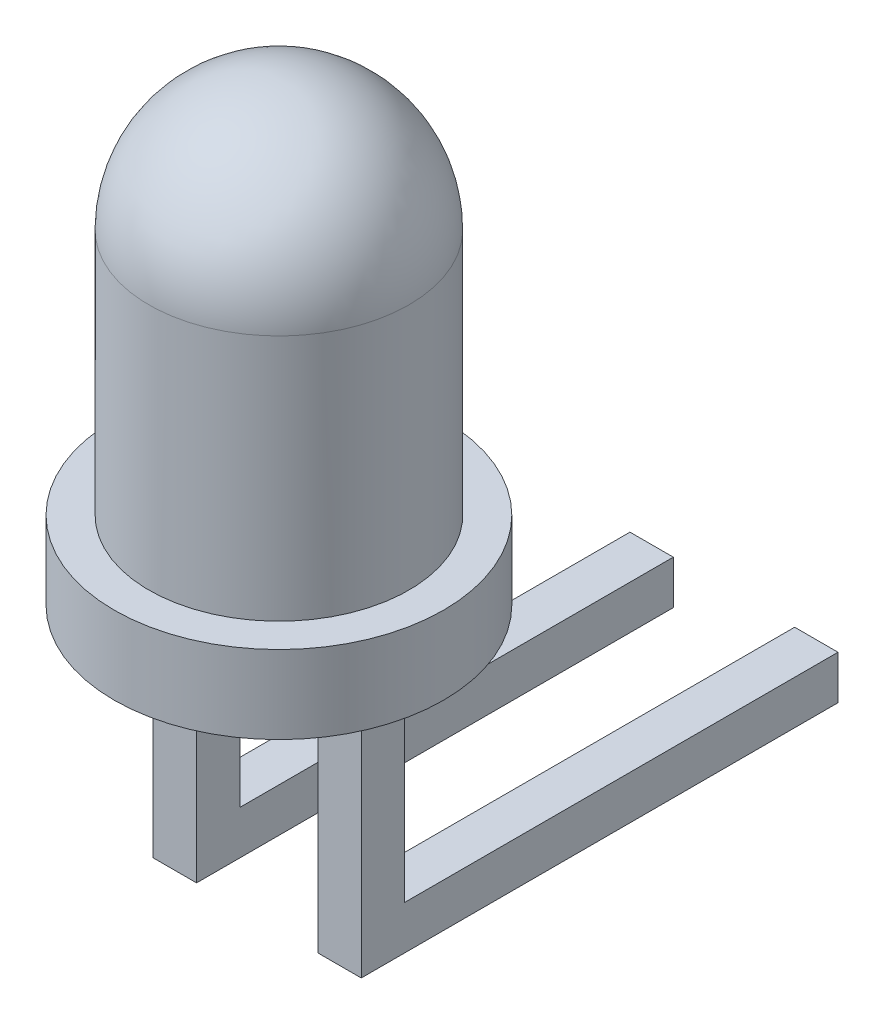
ISO-10303-21;
HEADER;
FILE_DESCRIPTION(('STEP AP214'),'2;1');
FILE_NAME('part.step','',(''),(''),'','','');
FILE_SCHEMA(('AUTOMOTIVE_DESIGN { 1 0 10303 214 1 1 1 1 }'));
ENDSEC;
DATA;
#1=APPLICATION_CONTEXT('core data for automotive mechanical design processes');
#2=APPLICATION_PROTOCOL_DEFINITION('international standard','automotive_design',2000,#1);
#3=PRODUCT_CONTEXT('',#1,'mechanical');
#4=PRODUCT('Part','Part','',(#3));
#5=PRODUCT_RELATED_PRODUCT_CATEGORY('part','',(#4));
#6=PRODUCT_DEFINITION_FORMATION('','',#4);
#7=PRODUCT_DEFINITION_CONTEXT('part definition',#1,'design');
#8=PRODUCT_DEFINITION('design','',#6,#7);
#9=PRODUCT_DEFINITION_SHAPE('','',#8);
#10=(LENGTH_UNIT() NAMED_UNIT(*) SI_UNIT(.MILLI.,.METRE.));
#11=(NAMED_UNIT(*) PLANE_ANGLE_UNIT() SI_UNIT($,.RADIAN.));
#12=(NAMED_UNIT(*) SI_UNIT($,.STERADIAN.) SOLID_ANGLE_UNIT());
#13=UNCERTAINTY_MEASURE_WITH_UNIT(LENGTH_MEASURE(1.E-05),#10,'distance_accuracy_value','');
#14=(GEOMETRIC_REPRESENTATION_CONTEXT(3) GLOBAL_UNCERTAINTY_ASSIGNED_CONTEXT((#13)) GLOBAL_UNIT_ASSIGNED_CONTEXT((#10,
#11,#12)) REPRESENTATION_CONTEXT('',''));
#15=CARTESIAN_POINT('',(0.,0.,0.));
#16=DIRECTION('',(0.,0.,1.));
#17=DIRECTION('',(1.,0.,0.));
#18=AXIS2_PLACEMENT_3D('',#15,#16,#17);
#19=CARTESIAN_POINT('',(0.,0.,-0.25));
#20=DIRECTION('',(0.,0.,-1.));
#21=DIRECTION('',(-1.,0.,0.));
#22=AXIS2_PLACEMENT_3D('',#19,#20,#21);
#23=PLANE('',#22);
#24=DIRECTION('',(0.,1.,0.));
#25=VECTOR('',#24,1.);
#26=CARTESIAN_POINT('',(1.2,2.31652278103782,-0.25));
#27=LINE('',#26,#25);
#28=CARTESIAN_POINT('',(1.2,-0.178679438290557,-0.25));
#29=VERTEX_POINT('',#28);
#30=CARTESIAN_POINT('',(1.2,2.31652278103782,-0.25));
#31=VERTEX_POINT('',#30);
#32=EDGE_CURVE('E168',#29,#31,#27,.T.);
#33=ORIENTED_EDGE('',*,*,#32,.F.);
#34=DIRECTION('',(1.,0.,0.));
#35=VECTOR('',#34,1.);
#36=CARTESIAN_POINT('',(0.700000000000002,-0.178679438290557,-0.25));
#37=LINE('',#36,#35);
#38=CARTESIAN_POINT('',(0.700000000000002,-0.178679438290557,-0.25));
#39=VERTEX_POINT('',#38);
#40=EDGE_CURVE('E140',#39,#29,#37,.T.);
#41=ORIENTED_EDGE('',*,*,#40,.F.);
#42=DIRECTION('',(0.,-1.,0.));
#43=VECTOR('',#42,1.);
#44=CARTESIAN_POINT('',(0.700000000000002,-0.683477218962181,-0.25));
#45=LINE('',#44,#43);
#46=CARTESIAN_POINT('',(0.700000000000001,2.31652278103782,-0.25));
#47=VERTEX_POINT('',#46);
#48=EDGE_CURVE('E145',#47,#39,#45,.T.);
#49=ORIENTED_EDGE('',*,*,#48,.F.);
#50=DIRECTION('',(-1.,0.,0.));
#51=VECTOR('',#50,1.);
#52=CARTESIAN_POINT('',(0.700000000000001,2.31652278103782,-0.25));
#53=LINE('',#52,#51);
#54=EDGE_CURVE('E178',#31,#47,#53,.T.);
#55=ORIENTED_EDGE('',*,*,#54,.F.);
#56=EDGE_LOOP('',(#33,#41,#49,#55));
#57=FACE_BOUND('',#56,.T.);
#58=ADVANCED_FACE('F32',(#57),#23,.T.);
#59=CARTESIAN_POINT('',(0.,0.,-0.25));
#60=DIRECTION('',(0.,0.,-1.));
#61=DIRECTION('',(-1.,0.,0.));
#62=AXIS2_PLACEMENT_3D('',#59,#60,#61);
#63=PLANE('',#62);
#64=DIRECTION('',(0.,1.,0.));
#65=VECTOR('',#64,1.);
#66=CARTESIAN_POINT('',(-0.699999999999999,2.31652278103782,-0.25));
#67=LINE('',#66,#65);
#68=CARTESIAN_POINT('',(-0.699999999999999,-0.178679438290556,-0.25));
#69=VERTEX_POINT('',#68);
#70=CARTESIAN_POINT('',(-0.699999999999999,2.31652278103782,-0.25));
#71=VERTEX_POINT('',#70);
#72=EDGE_CURVE('E192',#69,#71,#67,.T.);
#73=ORIENTED_EDGE('',*,*,#72,.F.);
#74=DIRECTION('',(1.,0.,0.));
#75=VECTOR('',#74,1.);
#76=CARTESIAN_POINT('',(-1.2,-0.178679438290556,-0.25));
#77=LINE('',#76,#75);
#78=CARTESIAN_POINT('',(-1.2,-0.178679438290556,-0.25));
#79=VERTEX_POINT('',#78);
#80=EDGE_CURVE('E146',#79,#69,#77,.T.);
#81=ORIENTED_EDGE('',*,*,#80,.F.);
#82=DIRECTION('',(0.,-1.,0.));
#83=VECTOR('',#82,1.);
#84=CARTESIAN_POINT('',(-1.2,-0.68347721896218,-0.25));
#85=LINE('',#84,#83);
#86=CARTESIAN_POINT('',(-1.2,2.31652278103782,-0.25));
#87=VERTEX_POINT('',#86);
#88=EDGE_CURVE('E201',#87,#79,#85,.T.);
#89=ORIENTED_EDGE('',*,*,#88,.F.);
#90=DIRECTION('',(-1.,0.,0.));
#91=VECTOR('',#90,1.);
#92=CARTESIAN_POINT('',(-0.699999999999999,2.31652278103782,-0.25));
#93=LINE('',#92,#91);
#94=EDGE_CURVE('E187',#71,#87,#93,.T.);
#95=ORIENTED_EDGE('',*,*,#94,.F.);
#96=EDGE_LOOP('',(#73,#81,#89,#95));
#97=FACE_BOUND('',#96,.T.);
#98=ADVANCED_FACE('F228',(#97),#63,.T.);
#99=CARTESIAN_POINT('',(-1.9,2.31652278103782,0.));
#100=DIRECTION('',(0.,-1.,0.));
#101=DIRECTION('',(1.,0.,0.));
#102=AXIS2_PLACEMENT_3D('',#99,#100,#101);
#103=PLANE('',#102);
#104=CARTESIAN_POINT('',(0.,2.31652278103782,0.));
#105=DIRECTION('',(0.,1.,0.));
#106=DIRECTION('',(-1.,0.,0.));
#107=AXIS2_PLACEMENT_3D('',#104,#105,#106);
#108=CIRCLE('',#107,1.9);
#109=CARTESIAN_POINT('',(-1.9,2.31652278103782,0.));
#110=VERTEX_POINT('',#109);
#111=EDGE_CURVE('E40',#110,#110,#108,.T.);
#112=ORIENTED_EDGE('',*,*,#111,.F.);
#113=EDGE_LOOP('',(#112));
#114=FACE_BOUND('',#113,.T.);
#115=DIRECTION('',(0.,0.,-1.));
#116=VECTOR('',#115,1.);
#117=CARTESIAN_POINT('',(-1.2,2.31652278103782,0.25));
#118=LINE('',#117,#116);
#119=CARTESIAN_POINT('',(-1.2,2.31652278103782,0.25));
#120=VERTEX_POINT('',#119);
#121=EDGE_CURVE('E211',#120,#87,#118,.T.);
#122=ORIENTED_EDGE('',*,*,#121,.F.);
#123=DIRECTION('',(-1.,0.,0.));
#124=VECTOR('',#123,1.);
#125=CARTESIAN_POINT('',(-0.699999999999999,2.31652278103782,0.25));
#126=LINE('',#125,#124);
#127=CARTESIAN_POINT('',(-0.699999999999999,2.31652278103782,0.25));
#128=VERTEX_POINT('',#127);
#129=EDGE_CURVE('E188',#128,#120,#126,.T.);
#130=ORIENTED_EDGE('',*,*,#129,.F.);
#131=DIRECTION('',(0.,0.,-1.));
#132=VECTOR('',#131,1.);
#133=CARTESIAN_POINT('',(-0.699999999999999,2.31652278103782,0.25));
#134=LINE('',#133,#132);
#135=EDGE_CURVE('E199',#128,#71,#134,.T.);
#136=ORIENTED_EDGE('',*,*,#135,.T.);
#137=ORIENTED_EDGE('',*,*,#94,.T.);
#138=EDGE_LOOP('',(#122,#130,#136,#137));
#139=FACE_BOUND('',#138,.T.);
#140=DIRECTION('',(0.,0.,-1.));
#141=VECTOR('',#140,1.);
#142=CARTESIAN_POINT('',(0.700000000000001,2.31652278103782,0.25));
#143=LINE('',#142,#141);
#144=CARTESIAN_POINT('',(0.700000000000001,2.31652278103782,0.25));
#145=VERTEX_POINT('',#144);
#146=EDGE_CURVE('E52',#145,#47,#143,.T.);
#147=ORIENTED_EDGE('',*,*,#146,.F.);
#148=DIRECTION('',(-1.,0.,0.));
#149=VECTOR('',#148,1.);
#150=CARTESIAN_POINT('',(0.700000000000001,2.31652278103782,0.25));
#151=LINE('',#150,#149);
#152=CARTESIAN_POINT('',(1.2,2.31652278103782,0.25));
#153=VERTEX_POINT('',#152);
#154=EDGE_CURVE('E47',#153,#145,#151,.T.);
#155=ORIENTED_EDGE('',*,*,#154,.F.);
#156=DIRECTION('',(0.,0.,-1.));
#157=VECTOR('',#156,1.);
#158=CARTESIAN_POINT('',(1.2,2.31652278103782,0.25));
#159=LINE('',#158,#157);
#160=EDGE_CURVE('E185',#153,#31,#159,.T.);
#161=ORIENTED_EDGE('',*,*,#160,.T.);
#162=ORIENTED_EDGE('',*,*,#54,.T.);
#163=EDGE_LOOP('',(#147,#155,#161,#162));
#164=FACE_BOUND('',#163,.T.);
#165=ADVANCED_FACE('F225',(#114,#139,#164),#103,.T.);
#166=CARTESIAN_POINT('',(-1.5,3.21652278103782,0.));
#167=DIRECTION('',(0.,1.,0.));
#168=DIRECTION('',(-1.,0.,0.));
#169=AXIS2_PLACEMENT_3D('',#166,#167,#168);
#170=PLANE('',#169);
#171=CARTESIAN_POINT('',(0.,3.21652278103782,0.));
#172=DIRECTION('',(0.,1.,0.));
#173=DIRECTION('',(-1.,0.,0.));
#174=AXIS2_PLACEMENT_3D('',#171,#172,#173);
#175=CIRCLE('',#174,1.9);
#176=CARTESIAN_POINT('',(-1.9,3.21652278103782,0.));
#177=VERTEX_POINT('',#176);
#178=EDGE_CURVE('E11',#177,#177,#175,.T.);
#179=ORIENTED_EDGE('',*,*,#178,.T.);
#180=EDGE_LOOP('',(#179));
#181=FACE_BOUND('',#180,.T.);
#182=CARTESIAN_POINT('',(0.,3.21652278103782,0.));
#183=DIRECTION('',(0.,1.,0.));
#184=DIRECTION('',(-1.,0.,0.));
#185=AXIS2_PLACEMENT_3D('',#182,#183,#184);
#186=CIRCLE('',#185,1.5);
#187=CARTESIAN_POINT('',(-1.5,3.21652278103782,0.));
#188=VERTEX_POINT('',#187);
#189=EDGE_CURVE('E214',#188,#188,#186,.T.);
#190=ORIENTED_EDGE('',*,*,#189,.F.);
#191=EDGE_LOOP('',(#190));
#192=FACE_BOUND('',#191,.T.);
#193=ADVANCED_FACE('F34',(#181,#192),#170,.T.);
#194=CARTESIAN_POINT('',(0.,7.56652278103782,0.));
#195=DIRECTION('',(0.,1.,0.));
#196=DIRECTION('',(-1.,0.,0.));
#197=AXIS2_PLACEMENT_3D('',#194,#195,#196);
#198=CYLINDRICAL_SURFACE('',#197,1.9);
#199=ORIENTED_EDGE('',*,*,#111,.T.);
#200=EDGE_LOOP('',(#199));
#201=FACE_BOUND('',#200,.T.);
#202=ORIENTED_EDGE('',*,*,#178,.F.);
#203=EDGE_LOOP('',(#202));
#204=FACE_BOUND('',#203,.T.);
#205=ADVANCED_FACE('F222',(#201,#204),#198,.T.);
#206=CARTESIAN_POINT('',(0.,6.06652278103782,0.));
#207=DIRECTION('',(0.,1.,0.));
#208=DIRECTION('',(1.,0.,0.));
#209=AXIS2_PLACEMENT_3D('',#206,#207,#208);
#210=SPHERICAL_SURFACE('',#209,1.5);
#211=CARTESIAN_POINT('',(0.,6.06652278103782,0.));
#212=DIRECTION('',(0.,1.,0.));
#213=DIRECTION('',(-1.,0.,0.));
#214=AXIS2_PLACEMENT_3D('',#211,#212,#213);
#215=CIRCLE('',#214,1.5);
#216=CARTESIAN_POINT('',(-1.5,6.06652278103782,0.));
#217=VERTEX_POINT('',#216);
#218=EDGE_CURVE('E217',#217,#217,#215,.T.);
#219=ORIENTED_EDGE('',*,*,#218,.T.);
#220=EDGE_LOOP('',(#219));
#221=FACE_BOUND('',#220,.T.);
#222=ADVANCED_FACE('F409',(#221),#210,.T.);
#223=CARTESIAN_POINT('',(0.,7.56652278103782,0.));
#224=DIRECTION('',(0.,1.,0.));
#225=DIRECTION('',(-1.,0.,0.));
#226=AXIS2_PLACEMENT_3D('',#223,#224,#225);
#227=CYLINDRICAL_SURFACE('',#226,1.5);
#228=ORIENTED_EDGE('',*,*,#189,.T.);
#229=EDGE_LOOP('',(#228));
#230=FACE_BOUND('',#229,.T.);
#231=ORIENTED_EDGE('',*,*,#218,.F.);
#232=EDGE_LOOP('',(#231));
#233=FACE_BOUND('',#232,.T.);
#234=ADVANCED_FACE('F265',(#230,#233),#227,.T.);
#235=CARTESIAN_POINT('',(-1.2,-0.68347721896218,0.25));
#236=DIRECTION('',(1.,0.,0.));
#237=DIRECTION('',(0.,0.,-1.));
#238=AXIS2_PLACEMENT_3D('',#235,#236,#237);
#239=PLANE('',#238);
#240=ORIENTED_EDGE('',*,*,#88,.T.);
#241=DIRECTION('',(0.,0.,1.));
#242=VECTOR('',#241,1.);
#243=CARTESIAN_POINT('',(-1.2,-0.178679438290556,-5.25));
#244=LINE('',#243,#242);
#245=CARTESIAN_POINT('',(-1.2,-0.178679438290556,-5.25));
#246=VERTEX_POINT('',#245);
#247=EDGE_CURVE('E166',#246,#79,#244,.T.);
#248=ORIENTED_EDGE('',*,*,#247,.F.);
#249=DIRECTION('',(0.,1.,0.));
#250=VECTOR('',#249,1.);
#251=CARTESIAN_POINT('',(-1.2,-0.68347721896218,-5.25));
#252=LINE('',#251,#250);
#253=CARTESIAN_POINT('',(-1.2,-0.68347721896218,-5.25));
#254=VERTEX_POINT('',#253);
#255=EDGE_CURVE('E148',#254,#246,#252,.T.);
#256=ORIENTED_EDGE('',*,*,#255,.F.);
#257=DIRECTION('',(0.,0.,-1.));
#258=VECTOR('',#257,1.);
#259=CARTESIAN_POINT('',(-1.2,-0.68347721896218,0.25));
#260=LINE('',#259,#258);
#261=CARTESIAN_POINT('',(-1.2,-0.68347721896218,0.25));
#262=VERTEX_POINT('',#261);
#263=EDGE_CURVE('E209',#262,#254,#260,.T.);
#264=ORIENTED_EDGE('',*,*,#263,.F.);
#265=DIRECTION('',(0.,-1.,0.));
#266=VECTOR('',#265,1.);
#267=CARTESIAN_POINT('',(-1.2,-0.68347721896218,0.25));
#268=LINE('',#267,#266);
#269=EDGE_CURVE('E191',#120,#262,#268,.T.);
#270=ORIENTED_EDGE('',*,*,#269,.F.);
#271=ORIENTED_EDGE('',*,*,#121,.T.);
#272=EDGE_LOOP('',(#240,#248,#256,#264,#270,#271));
#273=FACE_BOUND('',#272,.T.);
#274=ADVANCED_FACE('F235',(#273),#239,.F.);
#275=CARTESIAN_POINT('',(-0.699999999999999,-0.68347721896218,0.25));
#276=DIRECTION('',(0.,1.,0.));
#277=DIRECTION('',(0.,0.,1.));
#278=AXIS2_PLACEMENT_3D('',#275,#276,#277);
#279=PLANE('',#278);
#280=ORIENTED_EDGE('',*,*,#263,.T.);
#281=DIRECTION('',(-1.,0.,0.));
#282=VECTOR('',#281,1.);
#283=CARTESIAN_POINT('',(-1.2,-0.68347721896218,-5.25));
#284=LINE('',#283,#282);
#285=CARTESIAN_POINT('',(-0.699999999999999,-0.68347721896218,-5.25));
#286=VERTEX_POINT('',#285);
#287=EDGE_CURVE('E160',#286,#254,#284,.T.);
#288=ORIENTED_EDGE('',*,*,#287,.F.);
#289=DIRECTION('',(0.,0.,-1.));
#290=VECTOR('',#289,1.);
#291=CARTESIAN_POINT('',(-0.699999999999999,-0.68347721896218,0.25));
#292=LINE('',#291,#290);
#293=CARTESIAN_POINT('',(-0.699999999999999,-0.68347721896218,0.25));
#294=VERTEX_POINT('',#293);
#295=EDGE_CURVE('E207',#294,#286,#292,.T.);
#296=ORIENTED_EDGE('',*,*,#295,.F.);
#297=DIRECTION('',(1.,0.,0.));
#298=VECTOR('',#297,1.);
#299=CARTESIAN_POINT('',(-0.699999999999999,-0.68347721896218,0.25));
#300=LINE('',#299,#298);
#301=EDGE_CURVE('E194',#262,#294,#300,.T.);
#302=ORIENTED_EDGE('',*,*,#301,.F.);
#303=EDGE_LOOP('',(#280,#288,#296,#302));
#304=FACE_BOUND('',#303,.T.);
#305=ADVANCED_FACE('F257',(#304),#279,.F.);
#306=CARTESIAN_POINT('',(-0.699999999999999,2.31652278103782,0.25));
#307=DIRECTION('',(-1.,0.,0.));
#308=DIRECTION('',(0.,-1.,0.));
#309=AXIS2_PLACEMENT_3D('',#306,#307,#308);
#310=PLANE('',#309);
#311=ORIENTED_EDGE('',*,*,#295,.T.);
#312=DIRECTION('',(0.,-1.,0.));
#313=VECTOR('',#312,1.);
#314=CARTESIAN_POINT('',(-0.699999999999999,-0.68347721896218,-5.25));
#315=LINE('',#314,#313);
#316=CARTESIAN_POINT('',(-0.699999999999999,-0.178679438290556,-5.25));
#317=VERTEX_POINT('',#316);
#318=EDGE_CURVE('E157',#317,#286,#315,.T.);
#319=ORIENTED_EDGE('',*,*,#318,.F.);
#320=DIRECTION('',(0.,0.,1.));
#321=VECTOR('',#320,1.);
#322=CARTESIAN_POINT('',(-0.699999999999999,-0.178679438290556,-5.25));
#323=LINE('',#322,#321);
#324=EDGE_CURVE('E162',#317,#69,#323,.T.);
#325=ORIENTED_EDGE('',*,*,#324,.T.);
#326=ORIENTED_EDGE('',*,*,#72,.T.);
#327=ORIENTED_EDGE('',*,*,#135,.F.);
#328=DIRECTION('',(0.,1.,0.));
#329=VECTOR('',#328,1.);
#330=CARTESIAN_POINT('',(-0.699999999999999,2.31652278103782,0.25));
#331=LINE('',#330,#329);
#332=EDGE_CURVE('E196',#294,#128,#331,.T.);
#333=ORIENTED_EDGE('',*,*,#332,.F.);
#334=EDGE_LOOP('',(#311,#319,#325,#326,#327,#333));
#335=FACE_BOUND('',#334,.T.);
#336=ADVANCED_FACE('F244',(#335),#310,.F.);
#337=CARTESIAN_POINT('',(0.,0.,0.25));
#338=DIRECTION('',(0.,0.,-1.));
#339=DIRECTION('',(-1.,0.,0.));
#340=AXIS2_PLACEMENT_3D('',#337,#338,#339);
#341=PLANE('',#340);
#342=ORIENTED_EDGE('',*,*,#129,.T.);
#343=ORIENTED_EDGE('',*,*,#269,.T.);
#344=ORIENTED_EDGE('',*,*,#301,.T.);
#345=ORIENTED_EDGE('',*,*,#332,.T.);
#346=EDGE_LOOP('',(#342,#343,#344,#345));
#347=FACE_BOUND('',#346,.T.);
#348=ADVANCED_FACE('F239',(#347),#341,.F.);
#349=CARTESIAN_POINT('',(1.2,2.31652278103782,0.25));
#350=DIRECTION('',(-1.,0.,0.));
#351=DIRECTION('',(0.,-1.,0.));
#352=AXIS2_PLACEMENT_3D('',#349,#350,#351);
#353=PLANE('',#352);
#354=DIRECTION('',(0.,0.,-1.));
#355=VECTOR('',#354,1.);
#356=CARTESIAN_POINT('',(1.2,-0.68347721896218,0.25));
#357=LINE('',#356,#355);
#358=CARTESIAN_POINT('',(1.2,-0.68347721896218,0.25));
#359=VERTEX_POINT('',#358);
#360=CARTESIAN_POINT('',(1.2,-0.683477218962181,-5.25));
#361=VERTEX_POINT('',#360);
#362=EDGE_CURVE('E176',#359,#361,#357,.T.);
#363=ORIENTED_EDGE('',*,*,#362,.T.);
#364=DIRECTION('',(0.,-1.,0.));
#365=VECTOR('',#364,1.);
#366=CARTESIAN_POINT('',(1.2,-0.683477218962181,-5.25));
#367=LINE('',#366,#365);
#368=CARTESIAN_POINT('',(1.2,-0.178679438290557,-5.25));
#369=VERTEX_POINT('',#368);
#370=EDGE_CURVE('E130',#369,#361,#367,.T.);
#371=ORIENTED_EDGE('',*,*,#370,.F.);
#372=DIRECTION('',(0.,0.,1.));
#373=VECTOR('',#372,1.);
#374=CARTESIAN_POINT('',(1.2,-0.178679438290557,-5.25));
#375=LINE('',#374,#373);
#376=EDGE_CURVE('E126',#369,#29,#375,.T.);
#377=ORIENTED_EDGE('',*,*,#376,.T.);
#378=ORIENTED_EDGE('',*,*,#32,.T.);
#379=ORIENTED_EDGE('',*,*,#160,.F.);
#380=DIRECTION('',(0.,1.,0.));
#381=VECTOR('',#380,1.);
#382=CARTESIAN_POINT('',(1.2,2.31652278103782,0.25));
#383=LINE('',#382,#381);
#384=EDGE_CURVE('E169',#359,#153,#383,.T.);
#385=ORIENTED_EDGE('',*,*,#384,.F.);
#386=EDGE_LOOP('',(#363,#371,#377,#378,#379,#385));
#387=FACE_BOUND('',#386,.T.);
#388=ADVANCED_FACE('F285',(#387),#353,.F.);
#389=CARTESIAN_POINT('',(0.700000000000002,-0.683477218962181,0.25));
#390=DIRECTION('',(1.,0.,0.));
#391=DIRECTION('',(0.,1.,0.));
#392=AXIS2_PLACEMENT_3D('',#389,#390,#391);
#393=PLANE('',#392);
#394=ORIENTED_EDGE('',*,*,#48,.T.);
#395=DIRECTION('',(0.,0.,1.));
#396=VECTOR('',#395,1.);
#397=CARTESIAN_POINT('',(0.700000000000002,-0.178679438290557,-5.25));
#398=LINE('',#397,#396);
#399=CARTESIAN_POINT('',(0.700000000000002,-0.178679438290557,-5.25));
#400=VERTEX_POINT('',#399);
#401=EDGE_CURVE('E123',#400,#39,#398,.T.);
#402=ORIENTED_EDGE('',*,*,#401,.F.);
#403=DIRECTION('',(0.,1.,0.));
#404=VECTOR('',#403,1.);
#405=CARTESIAN_POINT('',(0.700000000000002,-0.683477218962181,-5.25));
#406=LINE('',#405,#404);
#407=CARTESIAN_POINT('',(0.700000000000002,-0.683477218962181,-5.25));
#408=VERTEX_POINT('',#407);
#409=EDGE_CURVE('E131',#408,#400,#406,.T.);
#410=ORIENTED_EDGE('',*,*,#409,.F.);
#411=DIRECTION('',(0.,0.,-1.));
#412=VECTOR('',#411,1.);
#413=CARTESIAN_POINT('',(0.700000000000002,-0.683477218962181,0.25));
#414=LINE('',#413,#412);
#415=CARTESIAN_POINT('',(0.700000000000002,-0.683477218962181,0.25));
#416=VERTEX_POINT('',#415);
#417=EDGE_CURVE('E182',#416,#408,#414,.T.);
#418=ORIENTED_EDGE('',*,*,#417,.F.);
#419=DIRECTION('',(0.,-1.,0.));
#420=VECTOR('',#419,1.);
#421=CARTESIAN_POINT('',(0.700000000000002,-0.683477218962181,0.25));
#422=LINE('',#421,#420);
#423=EDGE_CURVE('E172',#145,#416,#422,.T.);
#424=ORIENTED_EDGE('',*,*,#423,.F.);
#425=ORIENTED_EDGE('',*,*,#146,.T.);
#426=EDGE_LOOP('',(#394,#402,#410,#418,#424,#425));
#427=FACE_BOUND('',#426,.T.);
#428=ADVANCED_FACE('F143',(#427),#393,.F.);
#429=CARTESIAN_POINT('',(1.2,-0.68347721896218,0.25));
#430=DIRECTION('',(0.,1.,0.));
#431=DIRECTION('',(-1.,0.,0.));
#432=AXIS2_PLACEMENT_3D('',#429,#430,#431);
#433=PLANE('',#432);
#434=ORIENTED_EDGE('',*,*,#417,.T.);
#435=DIRECTION('',(-1.,0.,0.));
#436=VECTOR('',#435,1.);
#437=CARTESIAN_POINT('',(0.700000000000002,-0.683477218962181,-5.25));
#438=LINE('',#437,#436);
#439=EDGE_CURVE('E137',#361,#408,#438,.T.);
#440=ORIENTED_EDGE('',*,*,#439,.F.);
#441=ORIENTED_EDGE('',*,*,#362,.F.);
#442=DIRECTION('',(1.,0.,0.));
#443=VECTOR('',#442,1.);
#444=CARTESIAN_POINT('',(1.2,-0.68347721896218,0.25));
#445=LINE('',#444,#443);
#446=EDGE_CURVE('E174',#416,#359,#445,.T.);
#447=ORIENTED_EDGE('',*,*,#446,.F.);
#448=EDGE_LOOP('',(#434,#440,#441,#447));
#449=FACE_BOUND('',#448,.T.);
#450=ADVANCED_FACE('F279',(#449),#433,.F.);
#451=CARTESIAN_POINT('',(0.,0.,0.25));
#452=DIRECTION('',(0.,0.,-1.));
#453=DIRECTION('',(-1.,0.,0.));
#454=AXIS2_PLACEMENT_3D('',#451,#452,#453);
#455=PLANE('',#454);
#456=ORIENTED_EDGE('',*,*,#384,.T.);
#457=ORIENTED_EDGE('',*,*,#154,.T.);
#458=ORIENTED_EDGE('',*,*,#423,.T.);
#459=ORIENTED_EDGE('',*,*,#446,.T.);
#460=EDGE_LOOP('',(#456,#457,#458,#459));
#461=FACE_BOUND('',#460,.T.);
#462=ADVANCED_FACE('F277',(#461),#455,.F.);
#463=CARTESIAN_POINT('',(-1.2,-0.178679438290556,-5.25));
#464=DIRECTION('',(0.,-1.,0.));
#465=DIRECTION('',(0.,0.,-1.));
#466=AXIS2_PLACEMENT_3D('',#463,#464,#465);
#467=PLANE('',#466);
#468=ORIENTED_EDGE('',*,*,#80,.T.);
#469=ORIENTED_EDGE('',*,*,#324,.F.);
#470=DIRECTION('',(1.,0.,0.));
#471=VECTOR('',#470,1.);
#472=CARTESIAN_POINT('',(-1.2,-0.178679438290556,-5.25));
#473=LINE('',#472,#471);
#474=EDGE_CURVE('E155',#246,#317,#473,.T.);
#475=ORIENTED_EDGE('',*,*,#474,.F.);
#476=ORIENTED_EDGE('',*,*,#247,.T.);
#477=EDGE_LOOP('',(#468,#469,#475,#476));
#478=FACE_BOUND('',#477,.T.);
#479=ADVANCED_FACE('F250',(#478),#467,.F.);
#480=CARTESIAN_POINT('',(0.,0.,-5.25));
#481=DIRECTION('',(0.,0.,-1.));
#482=DIRECTION('',(-1.,0.,0.));
#483=AXIS2_PLACEMENT_3D('',#480,#481,#482);
#484=PLANE('',#483);
#485=ORIENTED_EDGE('',*,*,#255,.T.);
#486=ORIENTED_EDGE('',*,*,#474,.T.);
#487=ORIENTED_EDGE('',*,*,#318,.T.);
#488=ORIENTED_EDGE('',*,*,#287,.T.);
#489=EDGE_LOOP('',(#485,#486,#487,#488));
#490=FACE_BOUND('',#489,.T.);
#491=ADVANCED_FACE('F254',(#490),#484,.T.);
#492=CARTESIAN_POINT('',(0.700000000000002,-0.178679438290557,-5.25));
#493=DIRECTION('',(0.,-1.,0.));
#494=DIRECTION('',(0.,0.,-1.));
#495=AXIS2_PLACEMENT_3D('',#492,#493,#494);
#496=PLANE('',#495);
#497=ORIENTED_EDGE('',*,*,#40,.T.);
#498=ORIENTED_EDGE('',*,*,#376,.F.);
#499=DIRECTION('',(1.,0.,0.));
#500=VECTOR('',#499,1.);
#501=CARTESIAN_POINT('',(0.700000000000002,-0.178679438290557,-5.25));
#502=LINE('',#501,#500);
#503=EDGE_CURVE('E119',#400,#369,#502,.T.);
#504=ORIENTED_EDGE('',*,*,#503,.F.);
#505=ORIENTED_EDGE('',*,*,#401,.T.);
#506=EDGE_LOOP('',(#497,#498,#504,#505));
#507=FACE_BOUND('',#506,.T.);
#508=ADVANCED_FACE('F121',(#507),#496,.F.);
#509=CARTESIAN_POINT('',(0.,0.,-5.25));
#510=DIRECTION('',(0.,0.,-1.));
#511=DIRECTION('',(-1.,0.,0.));
#512=AXIS2_PLACEMENT_3D('',#509,#510,#511);
#513=PLANE('',#512);
#514=ORIENTED_EDGE('',*,*,#409,.T.);
#515=ORIENTED_EDGE('',*,*,#503,.T.);
#516=ORIENTED_EDGE('',*,*,#370,.T.);
#517=ORIENTED_EDGE('',*,*,#439,.T.);
#518=EDGE_LOOP('',(#514,#515,#516,#517));
#519=FACE_BOUND('',#518,.T.);
#520=ADVANCED_FACE('F135',(#519),#513,.T.);
#521=CLOSED_SHELL('',(#58,#98,#165,#193,#205,#222,#234,#274,#305,#336,#348,#388,#428,#450,#462,
#479,#491,#508,#520));
#522=MANIFOLD_SOLID_BREP('B2',#521);
#523=ADVANCED_BREP_SHAPE_REPRESENTATION('',(#18,#522),#14);
#524=SHAPE_DEFINITION_REPRESENTATION(#9,#523);
ENDSEC;
END-ISO-10303-21;
